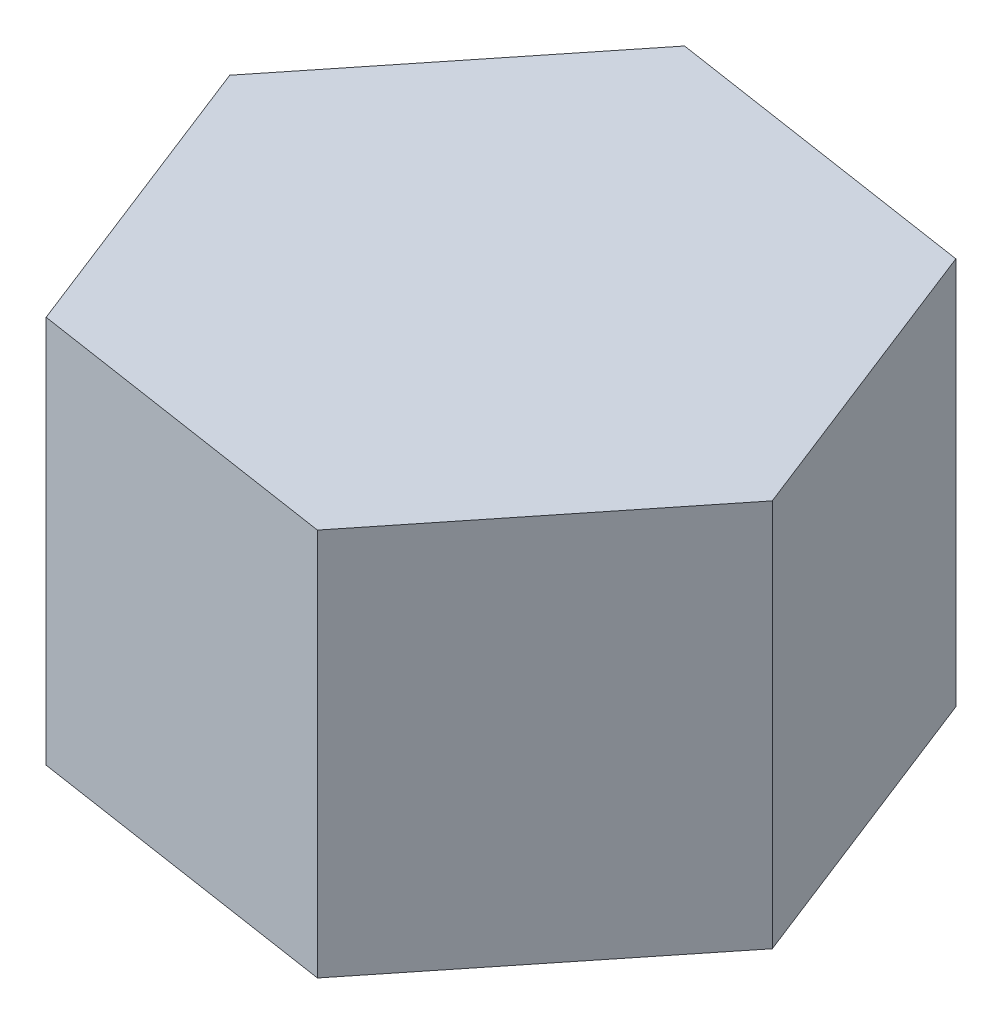
ISO-10303-21;
HEADER;
FILE_DESCRIPTION(('STEP AP214'),'2;1');
FILE_NAME('part.step','',(''),(''),'','','');
FILE_SCHEMA(('AUTOMOTIVE_DESIGN { 1 0 10303 214 1 1 1 1 }'));
ENDSEC;
DATA;
#1=APPLICATION_CONTEXT('core data for automotive mechanical design processes');
#2=APPLICATION_PROTOCOL_DEFINITION('international standard','automotive_design',2000,#1);
#3=PRODUCT_CONTEXT('',#1,'mechanical');
#4=PRODUCT('Part','Part','',(#3));
#5=PRODUCT_RELATED_PRODUCT_CATEGORY('part','',(#4));
#6=PRODUCT_DEFINITION_FORMATION('','',#4);
#7=PRODUCT_DEFINITION_CONTEXT('part definition',#1,'design');
#8=PRODUCT_DEFINITION('design','',#6,#7);
#9=PRODUCT_DEFINITION_SHAPE('','',#8);
#10=(LENGTH_UNIT() NAMED_UNIT(*) SI_UNIT(.MILLI.,.METRE.));
#11=(NAMED_UNIT(*) PLANE_ANGLE_UNIT() SI_UNIT($,.RADIAN.));
#12=(NAMED_UNIT(*) SI_UNIT($,.STERADIAN.) SOLID_ANGLE_UNIT());
#13=UNCERTAINTY_MEASURE_WITH_UNIT(LENGTH_MEASURE(1.E-05),#10,'distance_accuracy_value','');
#14=(GEOMETRIC_REPRESENTATION_CONTEXT(3) GLOBAL_UNCERTAINTY_ASSIGNED_CONTEXT((#13)) GLOBAL_UNIT_ASSIGNED_CONTEXT((#10,
#11,#12)) REPRESENTATION_CONTEXT('',''));
#15=CARTESIAN_POINT('',(0.,0.,0.));
#16=DIRECTION('',(0.,0.,1.));
#17=DIRECTION('',(1.,0.,0.));
#18=AXIS2_PLACEMENT_3D('',#15,#16,#17);
#19=CARTESIAN_POINT('',(5.77350269189626,7.,0.878229105287899));
#20=DIRECTION('',(-0.931368616987037,0.,0.364077600645321));
#21=DIRECTION('',(0.364077600645321,0.,0.931368616987037));
#22=AXIS2_PLACEMENT_3D('',#19,#20,#21);
#23=PLANE('',#22);
#24=DIRECTION('',(-0.364077600645321,0.,-0.931368616987037));
#25=VECTOR('',#24,1.);
#26=CARTESIAN_POINT('',(5.77350269189626,0.,0.878229105287899));
#27=LINE('',#26,#25);
#28=CARTESIAN_POINT('',(5.77350269189626,0.,0.878229105287899));
#29=VERTEX_POINT('',#28);
#30=CARTESIAN_POINT('',(3.64732006147033,0.,-4.56088544735605));
#31=VERTEX_POINT('',#30);
#32=EDGE_CURVE('E130',#29,#31,#27,.T.);
#33=ORIENTED_EDGE('',*,*,#32,.T.);
#34=DIRECTION('',(0.,-1.,0.));
#35=VECTOR('',#34,1.);
#36=CARTESIAN_POINT('',(3.64732006147033,7.,-4.56088544735605));
#37=LINE('',#36,#35);
#38=CARTESIAN_POINT('',(3.64732006147033,7.,-4.56088544735605));
#39=VERTEX_POINT('',#38);
#40=EDGE_CURVE('E11',#39,#31,#37,.T.);
#41=ORIENTED_EDGE('',*,*,#40,.F.);
#42=DIRECTION('',(-0.364077600645321,0.,-0.931368616987037));
#43=VECTOR('',#42,1.);
#44=CARTESIAN_POINT('',(5.77350269189626,7.,0.878229105287899));
#45=LINE('',#44,#43);
#46=CARTESIAN_POINT('',(5.77350269189626,7.,0.878229105287899));
#47=VERTEX_POINT('',#46);
#48=EDGE_CURVE('E142',#47,#39,#45,.T.);
#49=ORIENTED_EDGE('',*,*,#48,.F.);
#50=DIRECTION('',(0.,-1.,0.));
#51=VECTOR('',#50,1.);
#52=CARTESIAN_POINT('',(5.77350269189626,7.,0.878229105287899));
#53=LINE('',#52,#51);
#54=EDGE_CURVE('E126',#47,#29,#53,.T.);
#55=ORIENTED_EDGE('',*,*,#54,.T.);
#56=EDGE_LOOP('',(#33,#41,#49,#55));
#57=FACE_BOUND('',#56,.T.);
#58=ADVANCED_FACE('F34',(#57),#23,.F.);
#59=CARTESIAN_POINT('',(3.64732006147033,7.,-4.56088544735605));
#60=DIRECTION('',(-0.150383857385785,0.,0.988627682921014));
#61=DIRECTION('',(0.988627682921014,0.,0.150383857385785));
#62=AXIS2_PLACEMENT_3D('',#59,#60,#61);
#63=PLANE('',#62);
#64=DIRECTION('',(-0.988627682921013,0.,-0.150383857385785));
#65=VECTOR('',#64,1.);
#66=CARTESIAN_POINT('',(3.64732006147033,0.,-4.56088544735605));
#67=LINE('',#66,#65);
#68=CARTESIAN_POINT('',(-2.12618263042593,0.,-5.43911455264395));
#69=VERTEX_POINT('',#68);
#70=EDGE_CURVE('E133',#31,#69,#67,.T.);
#71=ORIENTED_EDGE('',*,*,#70,.T.);
#72=DIRECTION('',(0.,-1.,0.));
#73=VECTOR('',#72,1.);
#74=CARTESIAN_POINT('',(-2.12618263042593,7.,-5.43911455264395));
#75=LINE('',#74,#73);
#76=CARTESIAN_POINT('',(-2.12618263042593,7.,-5.43911455264395));
#77=VERTEX_POINT('',#76);
#78=EDGE_CURVE('E41',#77,#69,#75,.T.);
#79=ORIENTED_EDGE('',*,*,#78,.F.);
#80=DIRECTION('',(-0.988627682921013,0.,-0.150383857385785));
#81=VECTOR('',#80,1.);
#82=CARTESIAN_POINT('',(3.64732006147033,7.,-4.56088544735605));
#83=LINE('',#82,#81);
#84=EDGE_CURVE('E92',#39,#77,#83,.T.);
#85=ORIENTED_EDGE('',*,*,#84,.F.);
#86=ORIENTED_EDGE('',*,*,#40,.T.);
#87=EDGE_LOOP('',(#71,#79,#85,#86));
#88=FACE_BOUND('',#87,.T.);
#89=ADVANCED_FACE('F229',(#88),#63,.F.);
#90=CARTESIAN_POINT('',(-2.12618263042593,7.,-5.43911455264395));
#91=DIRECTION('',(0.780984759601252,0.,0.624550082275692));
#92=DIRECTION('',(0.624550082275692,0.,-0.780984759601252));
#93=AXIS2_PLACEMENT_3D('',#90,#91,#92);
#94=PLANE('',#93);
#95=DIRECTION('',(-0.624550082275692,0.,0.780984759601252));
#96=VECTOR('',#95,1.);
#97=CARTESIAN_POINT('',(-2.12618263042593,0.,-5.43911455264395));
#98=LINE('',#97,#96);
#99=CARTESIAN_POINT('',(-5.77350269189626,0.,-0.878229105287899));
#100=VERTEX_POINT('',#99);
#101=EDGE_CURVE('E136',#69,#100,#98,.T.);
#102=ORIENTED_EDGE('',*,*,#101,.T.);
#103=DIRECTION('',(0.,-1.,0.));
#104=VECTOR('',#103,1.);
#105=CARTESIAN_POINT('',(-5.77350269189626,7.,-0.878229105287899));
#106=LINE('',#105,#104);
#107=CARTESIAN_POINT('',(-5.77350269189626,7.,-0.878229105287899));
#108=VERTEX_POINT('',#107);
#109=EDGE_CURVE('E121',#108,#100,#106,.T.);
#110=ORIENTED_EDGE('',*,*,#109,.F.);
#111=DIRECTION('',(-0.624550082275692,0.,0.780984759601252));
#112=VECTOR('',#111,1.);
#113=CARTESIAN_POINT('',(-2.12618263042593,7.,-5.43911455264395));
#114=LINE('',#113,#112);
#115=EDGE_CURVE('E109',#77,#108,#114,.T.);
#116=ORIENTED_EDGE('',*,*,#115,.F.);
#117=ORIENTED_EDGE('',*,*,#78,.T.);
#118=EDGE_LOOP('',(#102,#110,#116,#117));
#119=FACE_BOUND('',#118,.T.);
#120=ADVANCED_FACE('F148',(#119),#94,.F.);
#121=CARTESIAN_POINT('',(-5.77350269189626,7.,-0.878229105287899));
#122=DIRECTION('',(0.931368616987037,0.,-0.364077600645321));
#123=DIRECTION('',(-0.364077600645321,0.,-0.931368616987037));
#124=AXIS2_PLACEMENT_3D('',#121,#122,#123);
#125=PLANE('',#124);
#126=DIRECTION('',(0.364077600645321,0.,0.931368616987037));
#127=VECTOR('',#126,1.);
#128=CARTESIAN_POINT('',(-5.77350269189626,0.,-0.878229105287899));
#129=LINE('',#128,#127);
#130=CARTESIAN_POINT('',(-3.64732006147033,0.,4.56088544735605));
#131=VERTEX_POINT('',#130);
#132=EDGE_CURVE('E118',#100,#131,#129,.T.);
#133=ORIENTED_EDGE('',*,*,#132,.T.);
#134=DIRECTION('',(0.,-1.,0.));
#135=VECTOR('',#134,1.);
#136=CARTESIAN_POINT('',(-3.64732006147033,7.,4.56088544735605));
#137=LINE('',#136,#135);
#138=CARTESIAN_POINT('',(-3.64732006147033,7.,4.56088544735605));
#139=VERTEX_POINT('',#138);
#140=EDGE_CURVE('E115',#139,#131,#137,.T.);
#141=ORIENTED_EDGE('',*,*,#140,.F.);
#142=DIRECTION('',(0.364077600645321,0.,0.931368616987037));
#143=VECTOR('',#142,1.);
#144=CARTESIAN_POINT('',(-5.77350269189626,7.,-0.878229105287899));
#145=LINE('',#144,#143);
#146=EDGE_CURVE('E102',#108,#139,#145,.T.);
#147=ORIENTED_EDGE('',*,*,#146,.F.);
#148=ORIENTED_EDGE('',*,*,#109,.T.);
#149=EDGE_LOOP('',(#133,#141,#147,#148));
#150=FACE_BOUND('',#149,.T.);
#151=ADVANCED_FACE('F116',(#150),#125,.F.);
#152=CARTESIAN_POINT('',(-3.64732006147033,7.,4.56088544735605));
#153=DIRECTION('',(0.150383857385785,0.,-0.988627682921014));
#154=DIRECTION('',(-0.988627682921014,0.,-0.150383857385785));
#155=AXIS2_PLACEMENT_3D('',#152,#153,#154);
#156=PLANE('',#155);
#157=DIRECTION('',(0.988627682921013,0.,0.150383857385785));
#158=VECTOR('',#157,1.);
#159=CARTESIAN_POINT('',(-3.64732006147033,0.,4.56088544735605));
#160=LINE('',#159,#158);
#161=CARTESIAN_POINT('',(2.12618263042593,0.,5.43911455264395));
#162=VERTEX_POINT('',#161);
#163=EDGE_CURVE('E139',#131,#162,#160,.T.);
#164=ORIENTED_EDGE('',*,*,#163,.T.);
#165=DIRECTION('',(0.,-1.,0.));
#166=VECTOR('',#165,1.);
#167=CARTESIAN_POINT('',(2.12618263042593,7.,5.43911455264395));
#168=LINE('',#167,#166);
#169=CARTESIAN_POINT('',(2.12618263042593,7.,5.43911455264395));
#170=VERTEX_POINT('',#169);
#171=EDGE_CURVE('E122',#170,#162,#168,.T.);
#172=ORIENTED_EDGE('',*,*,#171,.F.);
#173=DIRECTION('',(0.988627682921013,0.,0.150383857385785));
#174=VECTOR('',#173,1.);
#175=CARTESIAN_POINT('',(-3.64732006147033,7.,4.56088544735605));
#176=LINE('',#175,#174);
#177=EDGE_CURVE('E106',#139,#170,#176,.T.);
#178=ORIENTED_EDGE('',*,*,#177,.F.);
#179=ORIENTED_EDGE('',*,*,#140,.T.);
#180=EDGE_LOOP('',(#164,#172,#178,#179));
#181=FACE_BOUND('',#180,.T.);
#182=ADVANCED_FACE('F124',(#181),#156,.F.);
#183=CARTESIAN_POINT('',(2.12618263042593,7.,5.43911455264395));
#184=DIRECTION('',(-0.780984759601252,0.,-0.624550082275692));
#185=DIRECTION('',(-0.624550082275692,0.,0.780984759601252));
#186=AXIS2_PLACEMENT_3D('',#183,#184,#185);
#187=PLANE('',#186);
#188=DIRECTION('',(0.624550082275692,0.,-0.780984759601252));
#189=VECTOR('',#188,1.);
#190=CARTESIAN_POINT('',(2.12618263042593,0.,5.43911455264395));
#191=LINE('',#190,#189);
#192=EDGE_CURVE('E84',#162,#29,#191,.T.);
#193=ORIENTED_EDGE('',*,*,#192,.T.);
#194=ORIENTED_EDGE('',*,*,#54,.F.);
#195=DIRECTION('',(0.624550082275692,0.,-0.780984759601252));
#196=VECTOR('',#195,1.);
#197=CARTESIAN_POINT('',(2.12618263042593,7.,5.43911455264395));
#198=LINE('',#197,#196);
#199=EDGE_CURVE('E57',#170,#47,#198,.T.);
#200=ORIENTED_EDGE('',*,*,#199,.F.);
#201=ORIENTED_EDGE('',*,*,#171,.T.);
#202=EDGE_LOOP('',(#193,#194,#200,#201));
#203=FACE_BOUND('',#202,.T.);
#204=ADVANCED_FACE('F152',(#203),#187,.F.);
#205=CARTESIAN_POINT('',(0.,7.,0.));
#206=DIRECTION('',(0.,1.,0.));
#207=DIRECTION('',(0.,0.,1.));
#208=AXIS2_PLACEMENT_3D('',#205,#206,#207);
#209=PLANE('',#208);
#210=ORIENTED_EDGE('',*,*,#48,.T.);
#211=ORIENTED_EDGE('',*,*,#84,.T.);
#212=ORIENTED_EDGE('',*,*,#115,.T.);
#213=ORIENTED_EDGE('',*,*,#146,.T.);
#214=ORIENTED_EDGE('',*,*,#177,.T.);
#215=ORIENTED_EDGE('',*,*,#199,.T.);
#216=EDGE_LOOP('',(#210,#211,#212,#213,#214,#215));
#217=FACE_BOUND('',#216,.T.);
#218=ADVANCED_FACE('F104',(#217),#209,.T.);
#219=CARTESIAN_POINT('',(0.,0.,0.));
#220=DIRECTION('',(0.,1.,0.));
#221=DIRECTION('',(0.,0.,1.));
#222=AXIS2_PLACEMENT_3D('',#219,#220,#221);
#223=PLANE('',#222);
#224=DIRECTION('',(1.,0.,0.));
#225=VECTOR('',#224,1.);
#226=CARTESIAN_POINT('',(-4.2,0.,-1.3));
#227=LINE('',#226,#225);
#228=CARTESIAN_POINT('',(-4.2,0.,-1.3));
#229=VERTEX_POINT('',#228);
#230=CARTESIAN_POINT('',(4.2,0.,-1.3));
#231=VERTEX_POINT('',#230);
#232=EDGE_CURVE('E176',#229,#231,#227,.T.);
#233=ORIENTED_EDGE('',*,*,#232,.F.);
#234=DIRECTION('',(0.,0.,-1.));
#235=VECTOR('',#234,1.);
#236=CARTESIAN_POINT('',(-4.2,0.,-1.3));
#237=LINE('',#236,#235);
#238=CARTESIAN_POINT('',(-4.2,0.,1.1));
#239=VERTEX_POINT('',#238);
#240=EDGE_CURVE('E48',#239,#229,#237,.T.);
#241=ORIENTED_EDGE('',*,*,#240,.F.);
#242=DIRECTION('',(-1.,0.,0.));
#243=VECTOR('',#242,1.);
#244=CARTESIAN_POINT('',(4.2,0.,1.1));
#245=LINE('',#244,#243);
#246=CARTESIAN_POINT('',(4.2,0.,1.1));
#247=VERTEX_POINT('',#246);
#248=EDGE_CURVE('E169',#247,#239,#245,.T.);
#249=ORIENTED_EDGE('',*,*,#248,.F.);
#250=DIRECTION('',(0.,0.,1.));
#251=VECTOR('',#250,1.);
#252=CARTESIAN_POINT('',(4.2,0.,-1.3));
#253=LINE('',#252,#251);
#254=EDGE_CURVE('E173',#231,#247,#253,.T.);
#255=ORIENTED_EDGE('',*,*,#254,.F.);
#256=EDGE_LOOP('',(#233,#241,#249,#255));
#257=FACE_BOUND('',#256,.T.);
#258=ORIENTED_EDGE('',*,*,#32,.F.);
#259=ORIENTED_EDGE('',*,*,#192,.F.);
#260=ORIENTED_EDGE('',*,*,#163,.F.);
#261=ORIENTED_EDGE('',*,*,#132,.F.);
#262=ORIENTED_EDGE('',*,*,#101,.F.);
#263=ORIENTED_EDGE('',*,*,#70,.F.);
#264=EDGE_LOOP('',(#258,#259,#260,#261,#262,#263));
#265=FACE_BOUND('',#264,.T.);
#266=ADVANCED_FACE('F151',(#257,#265),#223,.F.);
#267=CARTESIAN_POINT('',(-4.2,5.,-1.3));
#268=DIRECTION('',(-1.,0.,0.));
#269=DIRECTION('',(0.,0.,1.));
#270=AXIS2_PLACEMENT_3D('',#267,#268,#269);
#271=PLANE('',#270);
#272=ORIENTED_EDGE('',*,*,#240,.T.);
#273=DIRECTION('',(0.,-1.,0.));
#274=VECTOR('',#273,1.);
#275=CARTESIAN_POINT('',(-4.2,5.,-1.3));
#276=LINE('',#275,#274);
#277=CARTESIAN_POINT('',(-4.2,5.,-1.3));
#278=VERTEX_POINT('',#277);
#279=EDGE_CURVE('E159',#278,#229,#276,.T.);
#280=ORIENTED_EDGE('',*,*,#279,.F.);
#281=DIRECTION('',(0.,0.,-1.));
#282=VECTOR('',#281,1.);
#283=CARTESIAN_POINT('',(-4.2,5.,-1.3));
#284=LINE('',#283,#282);
#285=CARTESIAN_POINT('',(-4.2,5.,1.1));
#286=VERTEX_POINT('',#285);
#287=EDGE_CURVE('E172',#286,#278,#284,.T.);
#288=ORIENTED_EDGE('',*,*,#287,.F.);
#289=DIRECTION('',(0.,-1.,0.));
#290=VECTOR('',#289,1.);
#291=CARTESIAN_POINT('',(-4.2,5.,1.1));
#292=LINE('',#291,#290);
#293=EDGE_CURVE('E134',#286,#239,#292,.T.);
#294=ORIENTED_EDGE('',*,*,#293,.T.);
#295=EDGE_LOOP('',(#272,#280,#288,#294));
#296=FACE_BOUND('',#295,.T.);
#297=ADVANCED_FACE('F197',(#296),#271,.F.);
#298=CARTESIAN_POINT('',(4.2,5.,1.1));
#299=DIRECTION('',(0.,0.,1.));
#300=DIRECTION('',(1.,0.,0.));
#301=AXIS2_PLACEMENT_3D('',#298,#299,#300);
#302=PLANE('',#301);
#303=ORIENTED_EDGE('',*,*,#248,.T.);
#304=ORIENTED_EDGE('',*,*,#293,.F.);
#305=DIRECTION('',(-1.,0.,0.));
#306=VECTOR('',#305,1.);
#307=CARTESIAN_POINT('',(4.2,5.,1.1));
#308=LINE('',#307,#306);
#309=CARTESIAN_POINT('',(4.2,5.,1.1));
#310=VERTEX_POINT('',#309);
#311=EDGE_CURVE('E162',#310,#286,#308,.T.);
#312=ORIENTED_EDGE('',*,*,#311,.F.);
#313=DIRECTION('',(0.,-1.,0.));
#314=VECTOR('',#313,1.);
#315=CARTESIAN_POINT('',(4.2,5.,1.1));
#316=LINE('',#315,#314);
#317=EDGE_CURVE('E165',#310,#247,#316,.T.);
#318=ORIENTED_EDGE('',*,*,#317,.T.);
#319=EDGE_LOOP('',(#303,#304,#312,#318));
#320=FACE_BOUND('',#319,.T.);
#321=ADVANCED_FACE('F208',(#320),#302,.F.);
#322=CARTESIAN_POINT('',(4.2,5.,-1.3));
#323=DIRECTION('',(1.,0.,0.));
#324=DIRECTION('',(0.,0.,-1.));
#325=AXIS2_PLACEMENT_3D('',#322,#323,#324);
#326=PLANE('',#325);
#327=ORIENTED_EDGE('',*,*,#254,.T.);
#328=ORIENTED_EDGE('',*,*,#317,.F.);
#329=DIRECTION('',(0.,0.,1.));
#330=VECTOR('',#329,1.);
#331=CARTESIAN_POINT('',(4.2,5.,-1.3));
#332=LINE('',#331,#330);
#333=CARTESIAN_POINT('',(4.2,5.,-1.3));
#334=VERTEX_POINT('',#333);
#335=EDGE_CURVE('E182',#334,#310,#332,.T.);
#336=ORIENTED_EDGE('',*,*,#335,.F.);
#337=DIRECTION('',(0.,-1.,0.));
#338=VECTOR('',#337,1.);
#339=CARTESIAN_POINT('',(4.2,5.,-1.3));
#340=LINE('',#339,#338);
#341=EDGE_CURVE('E161',#334,#231,#340,.T.);
#342=ORIENTED_EDGE('',*,*,#341,.T.);
#343=EDGE_LOOP('',(#327,#328,#336,#342));
#344=FACE_BOUND('',#343,.T.);
#345=ADVANCED_FACE('F213',(#344),#326,.F.);
#346=CARTESIAN_POINT('',(-4.2,5.,-1.3));
#347=DIRECTION('',(0.,0.,-1.));
#348=DIRECTION('',(-1.,0.,0.));
#349=AXIS2_PLACEMENT_3D('',#346,#347,#348);
#350=PLANE('',#349);
#351=ORIENTED_EDGE('',*,*,#232,.T.);
#352=ORIENTED_EDGE('',*,*,#341,.F.);
#353=DIRECTION('',(1.,0.,0.));
#354=VECTOR('',#353,1.);
#355=CARTESIAN_POINT('',(-4.2,5.,-1.3));
#356=LINE('',#355,#354);
#357=EDGE_CURVE('E185',#278,#334,#356,.T.);
#358=ORIENTED_EDGE('',*,*,#357,.F.);
#359=ORIENTED_EDGE('',*,*,#279,.T.);
#360=EDGE_LOOP('',(#351,#352,#358,#359));
#361=FACE_BOUND('',#360,.T.);
#362=ADVANCED_FACE('F218',(#361),#350,.F.);
#363=CARTESIAN_POINT('',(0.,5.,0.));
#364=DIRECTION('',(0.,-1.,0.));
#365=DIRECTION('',(0.,0.,-1.));
#366=AXIS2_PLACEMENT_3D('',#363,#364,#365);
#367=PLANE('',#366);
#368=ORIENTED_EDGE('',*,*,#287,.T.);
#369=ORIENTED_EDGE('',*,*,#357,.T.);
#370=ORIENTED_EDGE('',*,*,#335,.T.);
#371=ORIENTED_EDGE('',*,*,#311,.T.);
#372=EDGE_LOOP('',(#368,#369,#370,#371));
#373=FACE_BOUND('',#372,.T.);
#374=ADVANCED_FACE('F192',(#373),#367,.T.);
#375=CLOSED_SHELL('',(#58,#89,#120,#151,#182,#204,#218,#266,#297,#321,#345,#362,#374));
#376=MANIFOLD_SOLID_BREP('B2',#375);
#377=ADVANCED_BREP_SHAPE_REPRESENTATION('',(#18,#376),#14);
#378=SHAPE_DEFINITION_REPRESENTATION(#9,#377);
ENDSEC;
END-ISO-10303-21;
